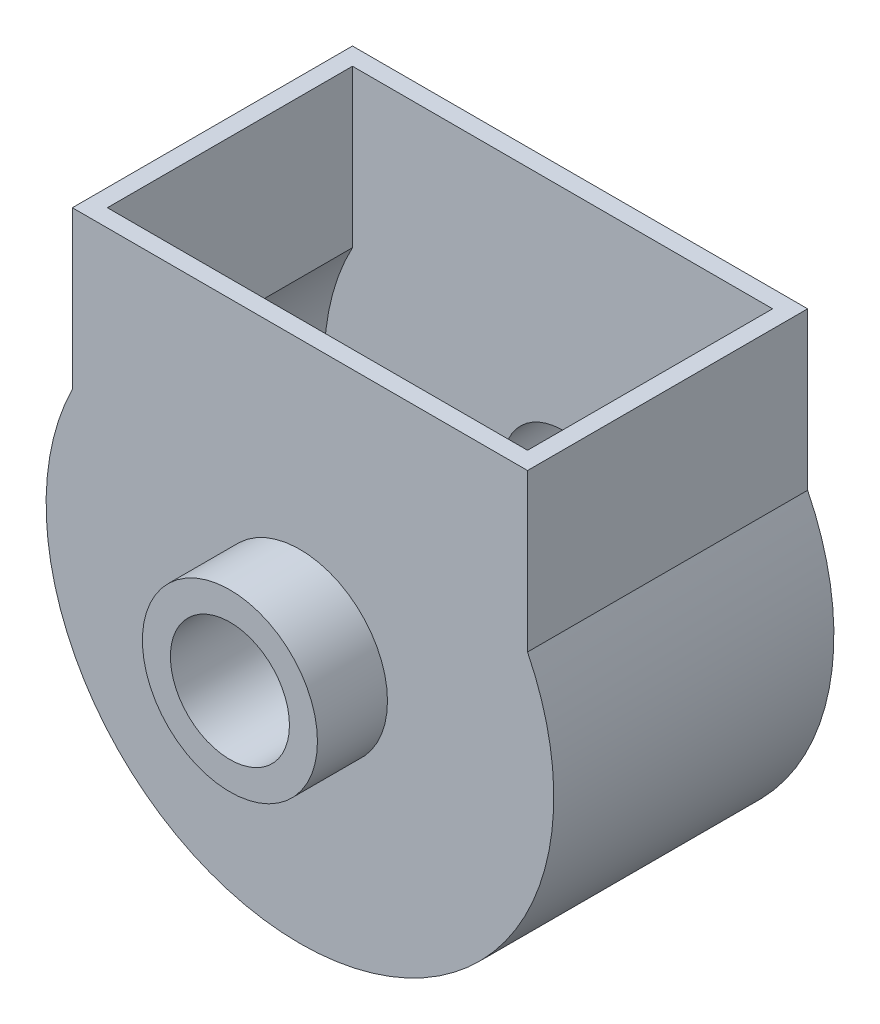
ISO-10303-21;
HEADER;
FILE_DESCRIPTION(('STEP AP214'),'2;1');
FILE_NAME('part.step','',(''),(''),'','','');
FILE_SCHEMA(('AUTOMOTIVE_DESIGN { 1 0 10303 214 1 1 1 1 }'));
ENDSEC;
DATA;
#1=APPLICATION_CONTEXT('core data for automotive mechanical design processes');
#2=APPLICATION_PROTOCOL_DEFINITION('international standard','automotive_design',2000,#1);
#3=PRODUCT_CONTEXT('',#1,'mechanical');
#4=PRODUCT('Part','Part','',(#3));
#5=PRODUCT_RELATED_PRODUCT_CATEGORY('part','',(#4));
#6=PRODUCT_DEFINITION_FORMATION('','',#4);
#7=PRODUCT_DEFINITION_CONTEXT('part definition',#1,'design');
#8=PRODUCT_DEFINITION('design','',#6,#7);
#9=PRODUCT_DEFINITION_SHAPE('','',#8);
#10=(LENGTH_UNIT() NAMED_UNIT(*) SI_UNIT(.MILLI.,.METRE.));
#11=(NAMED_UNIT(*) PLANE_ANGLE_UNIT() SI_UNIT($,.RADIAN.));
#12=(NAMED_UNIT(*) SI_UNIT($,.STERADIAN.) SOLID_ANGLE_UNIT());
#13=UNCERTAINTY_MEASURE_WITH_UNIT(LENGTH_MEASURE(1.E-05),#10,'distance_accuracy_value','');
#14=(GEOMETRIC_REPRESENTATION_CONTEXT(3) GLOBAL_UNCERTAINTY_ASSIGNED_CONTEXT((#13)) GLOBAL_UNIT_ASSIGNED_CONTEXT((#10,
#11,#12)) REPRESENTATION_CONTEXT('',''));
#15=CARTESIAN_POINT('',(0.,0.,0.));
#16=DIRECTION('',(0.,0.,1.));
#17=DIRECTION('',(1.,0.,0.));
#18=AXIS2_PLACEMENT_3D('',#15,#16,#17);
#19=CARTESIAN_POINT('',(0.,0.,-5.));
#20=DIRECTION('',(0.,0.,1.));
#21=DIRECTION('',(1.,0.,0.));
#22=AXIS2_PLACEMENT_3D('',#19,#20,#21);
#23=CYLINDRICAL_SURFACE('',#22,17.);
#24=CARTESIAN_POINT('',(0.,0.,20.));
#25=DIRECTION('',(0.,0.,-1.));
#26=DIRECTION('',(1.,0.,0.));
#27=AXIS2_PLACEMENT_3D('',#24,#25,#26);
#28=CIRCLE('',#27,17.);
#29=CARTESIAN_POINT('',(17.,0.,20.));
#30=VERTEX_POINT('',#29);
#31=EDGE_CURVE('E189',#30,#30,#28,.T.);
#32=ORIENTED_EDGE('',*,*,#31,.F.);
#33=EDGE_LOOP('',(#32));
#34=FACE_BOUND('',#33,.T.);
#35=CARTESIAN_POINT('',(0.,0.,-5.));
#36=DIRECTION('',(0.,0.,-1.));
#37=DIRECTION('',(1.,0.,0.));
#38=AXIS2_PLACEMENT_3D('',#35,#36,#37);
#39=CIRCLE('',#38,17.);
#40=CARTESIAN_POINT('',(17.,0.,-5.));
#41=VERTEX_POINT('',#40);
#42=EDGE_CURVE('E11',#41,#41,#39,.T.);
#43=ORIENTED_EDGE('',*,*,#42,.T.);
#44=EDGE_LOOP('',(#43));
#45=FACE_BOUND('',#44,.T.);
#46=ADVANCED_FACE('F36',(#34,#45),#23,.F.);
#47=CARTESIAN_POINT('',(0.,0.,-5.));
#48=DIRECTION('',(0.,0.,1.));
#49=DIRECTION('',(1.,0.,0.));
#50=AXIS2_PLACEMENT_3D('',#47,#48,#49);
#51=CYLINDRICAL_SURFACE('',#50,25.);
#52=CARTESIAN_POINT('',(0.,0.,20.));
#53=DIRECTION('',(0.,0.,1.));
#54=DIRECTION('',(1.,0.,0.));
#55=AXIS2_PLACEMENT_3D('',#52,#53,#54);
#56=CIRCLE('',#55,25.);
#57=CARTESIAN_POINT('',(25.,0.,20.));
#58=VERTEX_POINT('',#57);
#59=EDGE_CURVE('E43',#58,#58,#56,.T.);
#60=ORIENTED_EDGE('',*,*,#59,.F.);
#61=EDGE_LOOP('',(#60));
#62=FACE_BOUND('',#61,.T.);
#63=CARTESIAN_POINT('',(0.,0.,0.));
#64=DIRECTION('',(0.,0.,1.));
#65=DIRECTION('',(1.,0.,0.));
#66=AXIS2_PLACEMENT_3D('',#63,#64,#65);
#67=CIRCLE('',#66,25.);
#68=CARTESIAN_POINT('',(25.,0.,0.));
#69=VERTEX_POINT('',#68);
#70=EDGE_CURVE('E185',#69,#69,#67,.F.);
#71=ORIENTED_EDGE('',*,*,#70,.F.);
#72=EDGE_LOOP('',(#71));
#73=FACE_BOUND('',#72,.T.);
#74=ADVANCED_FACE('F196',(#62,#73),#51,.T.);
#75=CARTESIAN_POINT('',(0.,0.,-5.));
#76=DIRECTION('',(0.,0.,1.));
#77=DIRECTION('',(1.,0.,0.));
#78=AXIS2_PLACEMENT_3D('',#75,#76,#77);
#79=PLANE('',#78);
#80=ORIENTED_EDGE('',*,*,#42,.F.);
#81=EDGE_LOOP('',(#80));
#82=FACE_BOUND('',#81,.T.);
#83=DIRECTION('',(0.,1.,0.));
#84=VECTOR('',#83,1.);
#85=CARTESIAN_POINT('',(60.,77.,-5.));
#86=LINE('',#85,#84);
#87=CARTESIAN_POINT('',(60.,32.1130814466629,-5.));
#88=VERTEX_POINT('',#87);
#89=CARTESIAN_POINT('',(60.,77.,-5.));
#90=VERTEX_POINT('',#89);
#91=EDGE_CURVE('E137',#88,#90,#86,.T.);
#92=ORIENTED_EDGE('',*,*,#91,.F.);
#93=CARTESIAN_POINT('',(0.,0.,-5.));
#94=DIRECTION('',(0.,0.,1.));
#95=DIRECTION('',(1.,0.,0.));
#96=AXIS2_PLACEMENT_3D('',#93,#94,#95);
#97=CIRCLE('',#96,68.053287944081);
#98=CARTESIAN_POINT('',(-60.,32.1130814466629,-5.));
#99=VERTEX_POINT('',#98);
#100=EDGE_CURVE('E169',#88,#99,#97,.F.);
#101=ORIENTED_EDGE('',*,*,#100,.T.);
#102=DIRECTION('',(0.,1.,0.));
#103=VECTOR('',#102,1.);
#104=CARTESIAN_POINT('',(-60.,77.,-5.));
#105=LINE('',#104,#103);
#106=CARTESIAN_POINT('',(-60.,77.,-5.));
#107=VERTEX_POINT('',#106);
#108=EDGE_CURVE('E166',#99,#107,#105,.T.);
#109=ORIENTED_EDGE('',*,*,#108,.T.);
#110=DIRECTION('',(-1.,0.,0.));
#111=VECTOR('',#110,1.);
#112=CARTESIAN_POINT('',(0.,77.,-5.));
#113=LINE('',#112,#111);
#114=EDGE_CURVE('E175',#90,#107,#113,.T.);
#115=ORIENTED_EDGE('',*,*,#114,.F.);
#116=EDGE_LOOP('',(#92,#101,#109,#115));
#117=FACE_BOUND('',#116,.T.);
#118=ADVANCED_FACE('F199',(#82,#117),#79,.F.);
#119=CARTESIAN_POINT('',(0.,0.,20.));
#120=DIRECTION('',(0.,0.,1.));
#121=DIRECTION('',(1.,0.,0.));
#122=AXIS2_PLACEMENT_3D('',#119,#120,#121);
#123=PLANE('',#122);
#124=ORIENTED_EDGE('',*,*,#31,.T.);
#125=EDGE_LOOP('',(#124));
#126=FACE_BOUND('',#125,.T.);
#127=ORIENTED_EDGE('',*,*,#59,.T.);
#128=EDGE_LOOP('',(#127));
#129=FACE_BOUND('',#128,.T.);
#130=ADVANCED_FACE('F194',(#126,#129),#123,.T.);
#131=CARTESIAN_POINT('',(0.,0.,-5.));
#132=DIRECTION('',(0.,0.,1.));
#133=DIRECTION('',(1.,0.,0.));
#134=AXIS2_PLACEMENT_3D('',#131,#132,#133);
#135=CYLINDRICAL_SURFACE('',#134,72.5);
#136=CARTESIAN_POINT('',(0.,0.,0.));
#137=DIRECTION('',(0.,0.,1.));
#138=DIRECTION('',(1.,0.,0.));
#139=AXIS2_PLACEMENT_3D('',#136,#137,#138);
#140=CIRCLE('',#139,72.5);
#141=CARTESIAN_POINT('',(-65.,32.1130814466628,0.));
#142=VERTEX_POINT('',#141);
#143=CARTESIAN_POINT('',(65.,32.1130814466628,0.));
#144=VERTEX_POINT('',#143);
#145=EDGE_CURVE('E168',#142,#144,#140,.T.);
#146=ORIENTED_EDGE('',*,*,#145,.F.);
#147=DIRECTION('',(0.,0.,1.));
#148=VECTOR('',#147,1.);
#149=CARTESIAN_POINT('',(-65.,32.1130814466628,-5.));
#150=LINE('',#149,#148);
#151=CARTESIAN_POINT('',(-65.,32.1130814466628,-80.));
#152=VERTEX_POINT('',#151);
#153=EDGE_CURVE('E58',#152,#142,#150,.T.);
#154=ORIENTED_EDGE('',*,*,#153,.F.);
#155=CARTESIAN_POINT('',(0.,0.,-80.));
#156=DIRECTION('',(0.,0.,1.));
#157=DIRECTION('',(1.,0.,0.));
#158=AXIS2_PLACEMENT_3D('',#155,#156,#157);
#159=CIRCLE('',#158,72.5);
#160=CARTESIAN_POINT('',(65.,32.1130814466628,-80.));
#161=VERTEX_POINT('',#160);
#162=EDGE_CURVE('E112',#152,#161,#159,.T.);
#163=ORIENTED_EDGE('',*,*,#162,.T.);
#164=DIRECTION('',(0.,0.,1.));
#165=VECTOR('',#164,1.);
#166=CARTESIAN_POINT('',(65.,32.1130814466628,-5.));
#167=LINE('',#166,#165);
#168=EDGE_CURVE('E123',#161,#144,#167,.T.);
#169=ORIENTED_EDGE('',*,*,#168,.T.);
#170=EDGE_LOOP('',(#146,#154,#163,#169));
#171=FACE_BOUND('',#170,.T.);
#172=ADVANCED_FACE('F208',(#171),#135,.T.);
#173=CARTESIAN_POINT('',(-65.,77.,-5.));
#174=DIRECTION('',(-1.,0.,0.));
#175=DIRECTION('',(0.,0.,1.));
#176=AXIS2_PLACEMENT_3D('',#173,#174,#175);
#177=PLANE('',#176);
#178=DIRECTION('',(0.,-1.,0.));
#179=VECTOR('',#178,1.);
#180=CARTESIAN_POINT('',(-65.,77.,0.));
#181=LINE('',#180,#179);
#182=CARTESIAN_POINT('',(-65.,77.,0.));
#183=VERTEX_POINT('',#182);
#184=EDGE_CURVE('E179',#183,#142,#181,.T.);
#185=ORIENTED_EDGE('',*,*,#184,.F.);
#186=DIRECTION('',(0.,0.,1.));
#187=VECTOR('',#186,1.);
#188=CARTESIAN_POINT('',(-65.,77.,-5.));
#189=LINE('',#188,#187);
#190=CARTESIAN_POINT('',(-65.,77.,-80.));
#191=VERTEX_POINT('',#190);
#192=EDGE_CURVE('E178',#191,#183,#189,.T.);
#193=ORIENTED_EDGE('',*,*,#192,.F.);
#194=DIRECTION('',(0.,-1.,0.));
#195=VECTOR('',#194,1.);
#196=CARTESIAN_POINT('',(-65.,77.,-80.));
#197=LINE('',#196,#195);
#198=EDGE_CURVE('E110',#191,#152,#197,.T.);
#199=ORIENTED_EDGE('',*,*,#198,.T.);
#200=ORIENTED_EDGE('',*,*,#153,.T.);
#201=EDGE_LOOP('',(#185,#193,#199,#200));
#202=FACE_BOUND('',#201,.T.);
#203=ADVANCED_FACE('F209',(#202),#177,.T.);
#204=CARTESIAN_POINT('',(0.,77.,-5.));
#205=DIRECTION('',(0.,1.,0.));
#206=DIRECTION('',(-1.,0.,0.));
#207=AXIS2_PLACEMENT_3D('',#204,#205,#206);
#208=PLANE('',#207);
#209=DIRECTION('',(-1.,0.,0.));
#210=VECTOR('',#209,1.);
#211=CARTESIAN_POINT('',(0.,77.,0.));
#212=LINE('',#211,#210);
#213=CARTESIAN_POINT('',(65.,77.,0.));
#214=VERTEX_POINT('',#213);
#215=EDGE_CURVE('E119',#214,#183,#212,.T.);
#216=ORIENTED_EDGE('',*,*,#215,.F.);
#217=DIRECTION('',(0.,0.,1.));
#218=VECTOR('',#217,1.);
#219=CARTESIAN_POINT('',(65.,77.,-5.));
#220=LINE('',#219,#218);
#221=CARTESIAN_POINT('',(65.,77.,-80.));
#222=VERTEX_POINT('',#221);
#223=EDGE_CURVE('E115',#222,#214,#220,.T.);
#224=ORIENTED_EDGE('',*,*,#223,.F.);
#225=DIRECTION('',(-1.,0.,0.));
#226=VECTOR('',#225,1.);
#227=CARTESIAN_POINT('',(0.,77.,-80.));
#228=LINE('',#227,#226);
#229=EDGE_CURVE('E103',#222,#191,#228,.T.);
#230=ORIENTED_EDGE('',*,*,#229,.T.);
#231=ORIENTED_EDGE('',*,*,#192,.T.);
#232=EDGE_LOOP('',(#216,#224,#230,#231));
#233=FACE_BOUND('',#232,.T.);
#234=DIRECTION('',(0.,0.,-1.));
#235=VECTOR('',#234,1.);
#236=CARTESIAN_POINT('',(60.,77.,161.152038807834));
#237=LINE('',#236,#235);
#238=CARTESIAN_POINT('',(60.,77.,-75.));
#239=VERTEX_POINT('',#238);
#240=EDGE_CURVE('E136',#90,#239,#237,.T.);
#241=ORIENTED_EDGE('',*,*,#240,.F.);
#242=ORIENTED_EDGE('',*,*,#114,.T.);
#243=DIRECTION('',(0.,0.,-1.));
#244=VECTOR('',#243,1.);
#245=CARTESIAN_POINT('',(-60.,77.,161.152038807834));
#246=LINE('',#245,#244);
#247=CARTESIAN_POINT('',(-60.,77.,-75.));
#248=VERTEX_POINT('',#247);
#249=EDGE_CURVE('E50',#107,#248,#246,.T.);
#250=ORIENTED_EDGE('',*,*,#249,.T.);
#251=DIRECTION('',(-1.,0.,0.));
#252=VECTOR('',#251,1.);
#253=CARTESIAN_POINT('',(0.,77.,-75.));
#254=LINE('',#253,#252);
#255=EDGE_CURVE('E144',#239,#248,#254,.T.);
#256=ORIENTED_EDGE('',*,*,#255,.F.);
#257=EDGE_LOOP('',(#241,#242,#250,#256));
#258=FACE_BOUND('',#257,.T.);
#259=ADVANCED_FACE('F116',(#233,#258),#208,.T.);
#260=CARTESIAN_POINT('',(0.,0.,0.));
#261=DIRECTION('',(0.,0.,1.));
#262=DIRECTION('',(1.,0.,0.));
#263=AXIS2_PLACEMENT_3D('',#260,#261,#262);
#264=PLANE('',#263);
#265=ORIENTED_EDGE('',*,*,#70,.T.);
#266=EDGE_LOOP('',(#265));
#267=FACE_BOUND('',#266,.T.);
#268=ORIENTED_EDGE('',*,*,#145,.T.);
#269=DIRECTION('',(0.,-1.,0.));
#270=VECTOR('',#269,1.);
#271=CARTESIAN_POINT('',(65.,77.,0.));
#272=LINE('',#271,#270);
#273=EDGE_CURVE('E124',#214,#144,#272,.T.);
#274=ORIENTED_EDGE('',*,*,#273,.F.);
#275=ORIENTED_EDGE('',*,*,#215,.T.);
#276=ORIENTED_EDGE('',*,*,#184,.T.);
#277=EDGE_LOOP('',(#268,#274,#275,#276));
#278=FACE_BOUND('',#277,.T.);
#279=ADVANCED_FACE('F202',(#267,#278),#264,.T.);
#280=CARTESIAN_POINT('',(0.,0.,161.152038807834));
#281=DIRECTION('',(0.,0.,-1.));
#282=DIRECTION('',(-1.,0.,0.));
#283=AXIS2_PLACEMENT_3D('',#280,#281,#282);
#284=CYLINDRICAL_SURFACE('',#283,68.053287944081);
#285=ORIENTED_EDGE('',*,*,#100,.F.);
#286=DIRECTION('',(0.,0.,-1.));
#287=VECTOR('',#286,1.);
#288=CARTESIAN_POINT('',(60.,32.1130814466629,161.152038807834));
#289=LINE('',#288,#287);
#290=CARTESIAN_POINT('',(60.,32.1130814466629,-75.));
#291=VERTEX_POINT('',#290);
#292=EDGE_CURVE('E128',#88,#291,#289,.T.);
#293=ORIENTED_EDGE('',*,*,#292,.T.);
#294=CARTESIAN_POINT('',(0.,0.,-75.));
#295=DIRECTION('',(0.,0.,-1.));
#296=DIRECTION('',(1.,0.,0.));
#297=AXIS2_PLACEMENT_3D('',#294,#295,#296);
#298=CIRCLE('',#297,68.053287944081);
#299=CARTESIAN_POINT('',(-60.,32.1130814466629,-75.));
#300=VERTEX_POINT('',#299);
#301=EDGE_CURVE('E160',#291,#300,#298,.T.);
#302=ORIENTED_EDGE('',*,*,#301,.T.);
#303=DIRECTION('',(0.,0.,-1.));
#304=VECTOR('',#303,1.);
#305=CARTESIAN_POINT('',(-60.,32.1130814466629,161.152038807834));
#306=LINE('',#305,#304);
#307=EDGE_CURVE('E163',#99,#300,#306,.T.);
#308=ORIENTED_EDGE('',*,*,#307,.F.);
#309=EDGE_LOOP('',(#285,#293,#302,#308));
#310=FACE_BOUND('',#309,.T.);
#311=ADVANCED_FACE('F205',(#310),#284,.F.);
#312=CARTESIAN_POINT('',(-60.,77.,161.152038807834));
#313=DIRECTION('',(-1.,0.,0.));
#314=DIRECTION('',(0.,-1.,0.));
#315=AXIS2_PLACEMENT_3D('',#312,#313,#314);
#316=PLANE('',#315);
#317=ORIENTED_EDGE('',*,*,#108,.F.);
#318=ORIENTED_EDGE('',*,*,#307,.T.);
#319=DIRECTION('',(0.,1.,0.));
#320=VECTOR('',#319,1.);
#321=CARTESIAN_POINT('',(-60.,77.,-75.));
#322=LINE('',#321,#320);
#323=EDGE_CURVE('E161',#300,#248,#322,.T.);
#324=ORIENTED_EDGE('',*,*,#323,.T.);
#325=ORIENTED_EDGE('',*,*,#249,.F.);
#326=EDGE_LOOP('',(#317,#318,#324,#325));
#327=FACE_BOUND('',#326,.T.);
#328=ADVANCED_FACE('F237',(#327),#316,.F.);
#329=CARTESIAN_POINT('',(0.,0.,-75.));
#330=DIRECTION('',(0.,0.,-1.));
#331=DIRECTION('',(1.,0.,0.));
#332=AXIS2_PLACEMENT_3D('',#329,#330,#331);
#333=PLANE('',#332);
#334=CARTESIAN_POINT('',(0.,0.,-75.));
#335=DIRECTION('',(0.,0.,-1.));
#336=DIRECTION('',(1.,0.,0.));
#337=AXIS2_PLACEMENT_3D('',#334,#335,#336);
#338=CIRCLE('',#337,17.);
#339=CARTESIAN_POINT('',(17.,0.,-75.));
#340=VERTEX_POINT('',#339);
#341=EDGE_CURVE('E157',#340,#340,#338,.T.);
#342=ORIENTED_EDGE('',*,*,#341,.T.);
#343=EDGE_LOOP('',(#342));
#344=FACE_BOUND('',#343,.T.);
#345=ORIENTED_EDGE('',*,*,#323,.F.);
#346=ORIENTED_EDGE('',*,*,#301,.F.);
#347=DIRECTION('',(0.,1.,0.));
#348=VECTOR('',#347,1.);
#349=CARTESIAN_POINT('',(60.,77.,-75.));
#350=LINE('',#349,#348);
#351=EDGE_CURVE('E131',#291,#239,#350,.T.);
#352=ORIENTED_EDGE('',*,*,#351,.T.);
#353=ORIENTED_EDGE('',*,*,#255,.T.);
#354=EDGE_LOOP('',(#345,#346,#352,#353));
#355=FACE_BOUND('',#354,.T.);
#356=ADVANCED_FACE('F239',(#344,#355),#333,.F.);
#357=CARTESIAN_POINT('',(0.,0.,-75.));
#358=DIRECTION('',(0.,0.,-1.));
#359=DIRECTION('',(1.,0.,0.));
#360=AXIS2_PLACEMENT_3D('',#357,#358,#359);
#361=CYLINDRICAL_SURFACE('',#360,17.);
#362=CARTESIAN_POINT('',(0.,0.,-100.));
#363=DIRECTION('',(0.,0.,-1.));
#364=DIRECTION('',(1.,0.,0.));
#365=AXIS2_PLACEMENT_3D('',#362,#363,#364);
#366=CIRCLE('',#365,17.);
#367=CARTESIAN_POINT('',(17.,0.,-100.));
#368=VERTEX_POINT('',#367);
#369=EDGE_CURVE('E151',#368,#368,#366,.T.);
#370=ORIENTED_EDGE('',*,*,#369,.T.);
#371=EDGE_LOOP('',(#370));
#372=FACE_BOUND('',#371,.T.);
#373=ORIENTED_EDGE('',*,*,#341,.F.);
#374=EDGE_LOOP('',(#373));
#375=FACE_BOUND('',#374,.T.);
#376=ADVANCED_FACE('F241',(#372,#375),#361,.F.);
#377=CARTESIAN_POINT('',(0.,0.,-75.));
#378=DIRECTION('',(0.,0.,-1.));
#379=DIRECTION('',(1.,0.,0.));
#380=AXIS2_PLACEMENT_3D('',#377,#378,#379);
#381=CYLINDRICAL_SURFACE('',#380,25.);
#382=CARTESIAN_POINT('',(0.,0.,-100.));
#383=DIRECTION('',(0.,0.,1.));
#384=DIRECTION('',(1.,0.,0.));
#385=AXIS2_PLACEMENT_3D('',#382,#383,#384);
#386=CIRCLE('',#385,25.);
#387=CARTESIAN_POINT('',(25.,0.,-100.));
#388=VERTEX_POINT('',#387);
#389=EDGE_CURVE('E154',#388,#388,#386,.T.);
#390=ORIENTED_EDGE('',*,*,#389,.T.);
#391=EDGE_LOOP('',(#390));
#392=FACE_BOUND('',#391,.T.);
#393=CARTESIAN_POINT('',(0.,0.,-80.));
#394=DIRECTION('',(0.,0.,1.));
#395=DIRECTION('',(1.,0.,0.));
#396=AXIS2_PLACEMENT_3D('',#393,#394,#395);
#397=CIRCLE('',#396,25.);
#398=CARTESIAN_POINT('',(25.,0.,-80.));
#399=VERTEX_POINT('',#398);
#400=EDGE_CURVE('E146',#399,#399,#397,.F.);
#401=ORIENTED_EDGE('',*,*,#400,.T.);
#402=EDGE_LOOP('',(#401));
#403=FACE_BOUND('',#402,.T.);
#404=ADVANCED_FACE('F248',(#392,#403),#381,.T.);
#405=CARTESIAN_POINT('',(0.,0.,-100.));
#406=DIRECTION('',(0.,0.,-1.));
#407=DIRECTION('',(1.,0.,0.));
#408=AXIS2_PLACEMENT_3D('',#405,#406,#407);
#409=PLANE('',#408);
#410=ORIENTED_EDGE('',*,*,#369,.F.);
#411=EDGE_LOOP('',(#410));
#412=FACE_BOUND('',#411,.T.);
#413=ORIENTED_EDGE('',*,*,#389,.F.);
#414=EDGE_LOOP('',(#413));
#415=FACE_BOUND('',#414,.T.);
#416=ADVANCED_FACE('F254',(#412,#415),#409,.T.);
#417=CARTESIAN_POINT('',(0.,0.,-80.));
#418=DIRECTION('',(0.,0.,-1.));
#419=DIRECTION('',(1.,0.,0.));
#420=AXIS2_PLACEMENT_3D('',#417,#418,#419);
#421=PLANE('',#420);
#422=ORIENTED_EDGE('',*,*,#400,.F.);
#423=EDGE_LOOP('',(#422));
#424=FACE_BOUND('',#423,.T.);
#425=DIRECTION('',(0.,-1.,0.));
#426=VECTOR('',#425,1.);
#427=CARTESIAN_POINT('',(65.,77.,-80.));
#428=LINE('',#427,#426);
#429=EDGE_CURVE('E108',#222,#161,#428,.T.);
#430=ORIENTED_EDGE('',*,*,#429,.T.);
#431=ORIENTED_EDGE('',*,*,#162,.F.);
#432=ORIENTED_EDGE('',*,*,#198,.F.);
#433=ORIENTED_EDGE('',*,*,#229,.F.);
#434=EDGE_LOOP('',(#430,#431,#432,#433));
#435=FACE_BOUND('',#434,.T.);
#436=ADVANCED_FACE('F105',(#424,#435),#421,.T.);
#437=CARTESIAN_POINT('',(65.,77.,-5.));
#438=DIRECTION('',(1.,0.,0.));
#439=DIRECTION('',(0.,0.,1.));
#440=AXIS2_PLACEMENT_3D('',#437,#438,#439);
#441=PLANE('',#440);
#442=ORIENTED_EDGE('',*,*,#273,.T.);
#443=ORIENTED_EDGE('',*,*,#168,.F.);
#444=ORIENTED_EDGE('',*,*,#429,.F.);
#445=ORIENTED_EDGE('',*,*,#223,.T.);
#446=EDGE_LOOP('',(#442,#443,#444,#445));
#447=FACE_BOUND('',#446,.T.);
#448=ADVANCED_FACE('F126',(#447),#441,.T.);
#449=CARTESIAN_POINT('',(60.,77.,161.152038807834));
#450=DIRECTION('',(1.,0.,0.));
#451=DIRECTION('',(0.,-1.,0.));
#452=AXIS2_PLACEMENT_3D('',#449,#450,#451);
#453=PLANE('',#452);
#454=ORIENTED_EDGE('',*,*,#91,.T.);
#455=ORIENTED_EDGE('',*,*,#240,.T.);
#456=ORIENTED_EDGE('',*,*,#351,.F.);
#457=ORIENTED_EDGE('',*,*,#292,.F.);
#458=EDGE_LOOP('',(#454,#455,#456,#457));
#459=FACE_BOUND('',#458,.T.);
#460=ADVANCED_FACE('F233',(#459),#453,.F.);
#461=CLOSED_SHELL('',(#46,#74,#118,#130,#172,#203,#259,#279,#311,#328,#356,#376,#404,#416,#436,
#448,#460));
#462=MANIFOLD_SOLID_BREP('B2',#461);
#463=ADVANCED_BREP_SHAPE_REPRESENTATION('',(#18,#462),#14);
#464=SHAPE_DEFINITION_REPRESENTATION(#9,#463);
ENDSEC;
END-ISO-10303-21;
